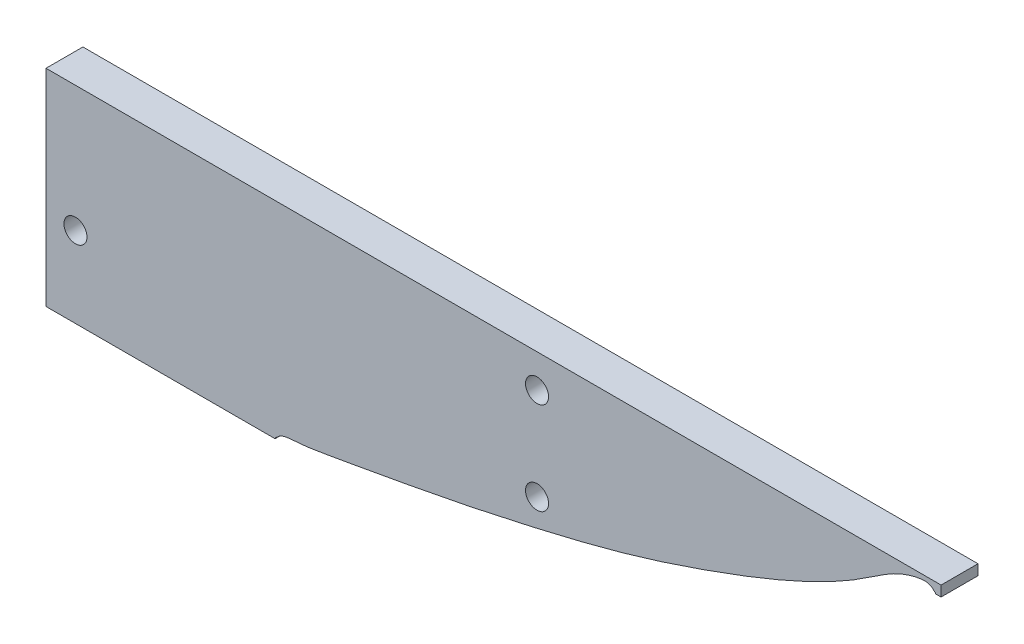
ISO-10303-21;
HEADER;
FILE_DESCRIPTION(('STEP AP214'),'2;1');
FILE_NAME('part.step','',(''),(''),'','','');
FILE_SCHEMA(('AUTOMOTIVE_DESIGN { 1 0 10303 214 1 1 1 1 }'));
ENDSEC;
DATA;
#1=APPLICATION_CONTEXT('core data for automotive mechanical design processes');
#2=APPLICATION_PROTOCOL_DEFINITION('international standard','automotive_design',2000,#1);
#3=PRODUCT_CONTEXT('',#1,'mechanical');
#4=PRODUCT('Part','Part','',(#3));
#5=PRODUCT_RELATED_PRODUCT_CATEGORY('part','',(#4));
#6=PRODUCT_DEFINITION_FORMATION('','',#4);
#7=PRODUCT_DEFINITION_CONTEXT('part definition',#1,'design');
#8=PRODUCT_DEFINITION('design','',#6,#7);
#9=PRODUCT_DEFINITION_SHAPE('','',#8);
#10=(LENGTH_UNIT() NAMED_UNIT(*) SI_UNIT(.MILLI.,.METRE.));
#11=(NAMED_UNIT(*) PLANE_ANGLE_UNIT() SI_UNIT($,.RADIAN.));
#12=(NAMED_UNIT(*) SI_UNIT($,.STERADIAN.) SOLID_ANGLE_UNIT());
#13=UNCERTAINTY_MEASURE_WITH_UNIT(LENGTH_MEASURE(1.E-05),#10,'distance_accuracy_value','');
#14=(GEOMETRIC_REPRESENTATION_CONTEXT(3) GLOBAL_UNCERTAINTY_ASSIGNED_CONTEXT((#13)) GLOBAL_UNIT_ASSIGNED_CONTEXT((#10,
#11,#12)) REPRESENTATION_CONTEXT('',''));
#15=CARTESIAN_POINT('',(0.,0.,0.));
#16=DIRECTION('',(0.,0.,1.));
#17=DIRECTION('',(1.,0.,0.));
#18=AXIS2_PLACEMENT_3D('',#15,#16,#17);
#19=CARTESIAN_POINT('',(17.1243728564483,-26.6404791174765,292.));
#20=DIRECTION('',(0.,0.,-1.));
#21=DIRECTION('',(-1.,0.,0.));
#22=AXIS2_PLACEMENT_3D('',#19,#20,#21);
#23=PLANE('',#22);
#24=CARTESIAN_POINT('',(0.0705666698621599,-25.,292.));
#25=DIRECTION('',(0.,0.,-1.));
#26=DIRECTION('',(-1.,0.,0.));
#27=AXIS2_PLACEMENT_3D('',#24,#25,#26);
#28=CIRCLE('',#27,2.5);
#29=CARTESIAN_POINT('',(-2.42943333013784,-25.,292.));
#30=VERTEX_POINT('',#29);
#31=EDGE_CURVE('E238',#30,#30,#28,.F.);
#32=ORIENTED_EDGE('',*,*,#31,.F.);
#33=EDGE_LOOP('',(#32));
#34=FACE_BOUND('',#33,.T.);
#35=CARTESIAN_POINT('',(86.5193378007218,1.10669936756458E-13,292.));
#36=CARTESIAN_POINT('',(86.4862790081582,0.0962597621961791,292.));
#37=CARTESIAN_POINT('',(86.4244500572542,0.17790147447394,292.));
#38=CARTESIAN_POINT('',(86.2815064068732,0.320825144004081,292.));
#39=CARTESIAN_POINT('',(86.2036291125369,0.384639030602337,292.));
#40=CARTESIAN_POINT('',(85.9706761006142,0.576891243185454,292.));
#41=CARTESIAN_POINT('',(85.8191488829801,0.709724725340839,292.));
#42=CARTESIAN_POINT('',(85.4904421493879,0.944124081837574,292.));
#43=CARTESIAN_POINT('',(85.3174465483556,1.04401765588407,292.));
#44=CARTESIAN_POINT('',(85.0338386836463,1.14556872036401,292.));
#45=CARTESIAN_POINT('',(84.9354194814334,1.17253531765186,292.));
#46=CARTESIAN_POINT('',(84.7388247548694,1.21363550304273,292.));
#47=CARTESIAN_POINT('',(84.6399014764517,1.22812207648879,292.));
#48=CARTESIAN_POINT('',(84.3417818792642,1.25850605059878,292.));
#49=CARTESIAN_POINT('',(84.1408367507932,1.26185781245953,292.));
#50=CARTESIAN_POINT('',(83.7389517485785,1.24965078016579,292.));
#51=CARTESIAN_POINT('',(83.5397015606246,1.23494652381473,292.));
#52=CARTESIAN_POINT('',(82.946125708914,1.1696168691251,292.));
#53=CARTESIAN_POINT('',(82.556150370626,1.09688207626837,292.));
#54=CARTESIAN_POINT('',(81.7815553124875,0.924193956727364,292.));
#55=CARTESIAN_POINT('',(81.397027838196,0.823771816050497,292.));
#56=CARTESIAN_POINT('',(80.6329455397681,0.597655337276839,292.));
#57=CARTESIAN_POINT('',(80.2534898519047,0.472294850637928,292.));
#58=CARTESIAN_POINT('',(79.1347487645557,0.066933477544559,292.));
#59=CARTESIAN_POINT('',(78.4109544343883,-0.244846641075704,292.));
#60=CARTESIAN_POINT('',(76.3037119302745,-1.30111184940393,292.));
#61=CARTESIAN_POINT('',(74.9812570061025,-2.1605882674563,292.));
#62=CARTESIAN_POINT('',(73.012868106171,-3.47863589350135,292.));
#63=CARTESIAN_POINT('',(72.3588964050103,-3.9220012521155,292.));
#64=CARTESIAN_POINT('',(71.0425433242173,-4.79342359867501,292.));
#65=CARTESIAN_POINT('',(70.3811463121936,-5.22330818465203,292.));
#66=CARTESIAN_POINT('',(68.3784340553434,-6.47945271713025,292.));
#67=CARTESIAN_POINT('',(67.0176553215151,-7.27049865431496,292.));
#68=CARTESIAN_POINT('',(64.2619432116094,-8.79079678295668,292.));
#69=CARTESIAN_POINT('',(62.8674151702466,-9.52078231982844,292.));
#70=CARTESIAN_POINT('',(60.0534337740831,-10.9356576648702,292.));
#71=CARTESIAN_POINT('',(58.6336688460083,-11.6199837640272,292.));
#72=CARTESIAN_POINT('',(55.7679281003753,-12.9412143255333,292.));
#73=CARTESIAN_POINT('',(54.3231814246012,-13.5784753310121,292.));
#74=CARTESIAN_POINT('',(49.9680149707943,-15.4346118173229,292.));
#75=CARTESIAN_POINT('',(47.0340497498493,-16.6012496027793,292.));
#76=CARTESIAN_POINT('',(41.133735633408,-18.8461693230346,292.));
#77=CARTESIAN_POINT('',(38.1657066142375,-19.9228932410447,292.));
#78=CARTESIAN_POINT('',(32.2044266865049,-21.997975534191,292.));
#79=CARTESIAN_POINT('',(29.2115132247264,-22.9979595653188,292.));
#80=CARTESIAN_POINT('',(23.1935285388077,-24.8995243197195,292.));
#81=CARTESIAN_POINT('',(20.1660422955707,-25.7975274973214,292.));
#82=CARTESIAN_POINT('',(14.0827034173254,-27.4834307376316,292.));
#83=CARTESIAN_POINT('',(11.0271965300401,-28.2725442778635,292.));
#84=CARTESIAN_POINT('',(4.89825720628841,-29.7810274909518,292.));
#85=CARTESIAN_POINT('',(1.82534026890185,-30.503499894055,292.));
#86=CARTESIAN_POINT('',(-7.40568625798334,-32.6136527882107,292.));
#87=CARTESIAN_POINT('',(-13.57923213932,-33.9331380147401,292.));
#88=CARTESIAN_POINT('',(-25.9695976396539,-36.361777090714,292.));
#89=CARTESIAN_POINT('',(-32.1831992386261,-37.480343491471,292.));
#90=CARTESIAN_POINT('',(-39.9513426039029,-38.8699583174506,292.));
#91=CARTESIAN_POINT('',(-41.5050766144523,-39.1473189251016,292.));
#92=CARTESIAN_POINT('',(-43.8369285317034,-39.5562123222397,292.));
#93=CARTESIAN_POINT('',(-44.6144305618867,-39.6912653287315,292.));
#94=CARTESIAN_POINT('',(-46.1697819880898,-39.959388388233,292.));
#95=CARTESIAN_POINT('',(-46.9472877219596,-40.0945807997366,292.));
#96=CARTESIAN_POINT('',(-48.5044895115571,-40.3507144330722,292.));
#97=CARTESIAN_POINT('',(-49.284581002103,-40.4691003882964,292.));
#98=CARTESIAN_POINT('',(-50.4602675555291,-40.6106385803979,292.));
#99=CARTESIAN_POINT('',(-50.8530521982789,-40.6520588401831,292.));
#100=CARTESIAN_POINT('',(-51.640361554793,-40.7223610754396,292.));
#101=CARTESIAN_POINT('',(-52.0352072229786,-40.7491440532411,292.));
#102=CARTESIAN_POINT('',(-52.8256272491158,-40.7975900849019,292.));
#103=CARTESIAN_POINT('',(-53.2207871806431,-40.8221649839273,292.));
#104=CARTESIAN_POINT('',(-54.0061453344125,-40.9061767703766,292.));
#105=CARTESIAN_POINT('',(-54.3969255741483,-40.9615242833646,292.));
#106=CARTESIAN_POINT('',(-54.9728332778868,-41.1166530805474,292.));
#107=CARTESIAN_POINT('',(-55.163008775375,-41.1809658447826,292.));
#108=CARTESIAN_POINT('',(-55.4436371129991,-41.3100008108665,292.));
#109=CARTESIAN_POINT('',(-55.5366574086851,-41.3588513616438,292.));
#110=CARTESIAN_POINT('',(-55.7134236431964,-41.465826689177,292.));
#111=CARTESIAN_POINT('',(-55.7982525340641,-41.5240164686866,292.));
#112=CARTESIAN_POINT('',(-56.0458001043853,-41.7077659939899,292.));
#113=CARTESIAN_POINT('',(-56.1993824071351,-41.8454128428669,292.));
#114=CARTESIAN_POINT('',(-56.4274655303399,-42.0549131429448,292.));
#115=CARTESIAN_POINT('',(-56.502689404142,-42.1260217191931,292.));
#116=CARTESIAN_POINT('',(-56.6371506499801,-42.2827013968764,292.));
#117=CARTESIAN_POINT('',(-56.6947280604683,-42.3718357842638,292.));
#118=CARTESIAN_POINT('',(-56.720801855106,-42.4717506298789,292.));
#119=B_SPLINE_CURVE_WITH_KNOTS('',3,(#35,#36,#37,#38,#39,#40,#41,#42,#43,#44,#45,#46,#47,#48,
#49,#50,#51,#52,#53,#54,#55,#56,#57,#58,#59,#60,#61,#62,#63,#64,#65,#66,#67,#68,#69,#70,#71,#72,
#73,#74,#75,#76,#77,#78,#79,#80,#81,#82,#83,#84,#85,#86,#87,#88,#89,#90,#91,#92,#93,#94,#95,#96,
#97,#98,#99,#100,#101,#102,#103,#104,#105,#106,#107,#108,#109,#110,#111,#112,#113,#114,#115,
#116,#117,#118),.UNSPECIFIED.,.F.,.F.,(4,2,2,2,2,2,2,2,2,2,2,2,2,2,2,2,2,2,2,2,2,2,2,2,2,2,2,2,
2,2,2,2,2,2,2,2,2,2,2,2,2,4),(0.,0.00195312500000022,0.00390625000000056,0.00781250000000078,
0.0117187500000011,0.0136718750000012,0.0156250000000014,0.0195312500000014,0.0234375000000014,
0.0312500000000016,0.0390625000000016,0.0468750000000017,0.0625000000000018,0.0937500000000018,
0.109375000000002,0.125000000000002,0.156250000000002,0.187500000000002,0.218750000000002,
0.250000000000002,0.312500000000002,0.375000000000001,0.437500000000001,0.500000000000001,
0.562500000000001,0.625000000000001,0.750000000000001,0.875,0.90625,0.921875,0.9375,0.953125,
0.9609375,0.96875,0.9765625,0.984375,0.98828125,0.990234375,0.9921875,0.99609375,0.998046875,
1.),.UNSPECIFIED.);
#120=CARTESIAN_POINT('',(-56.720801855106,-42.4717506298789,292.));
#121=VERTEX_POINT('',#120);
#122=CARTESIAN_POINT('',(86.5193378007219,0.,292.));
#123=VERTEX_POINT('',#122);
#124=EDGE_CURVE('E196',#121,#123,#119,.F.);
#125=ORIENTED_EDGE('',*,*,#124,.T.);
#126=DIRECTION('',(1.,0.,0.));
#127=VECTOR('',#126,1.);
#128=CARTESIAN_POINT('',(86.5193378007219,0.,292.));
#129=LINE('',#128,#127);
#130=CARTESIAN_POINT('',(87.6687095894295,0.,292.));
#131=VERTEX_POINT('',#130);
#132=EDGE_CURVE('E90',#123,#131,#129,.T.);
#133=ORIENTED_EDGE('',*,*,#132,.T.);
#134=DIRECTION('',(0.,1.,0.));
#135=VECTOR('',#134,1.);
#136=CARTESIAN_POINT('',(87.6687095894295,2.25600000000004,292.));
#137=LINE('',#136,#135);
#138=CARTESIAN_POINT('',(87.6687095894295,2.25600000000004,292.));
#139=VERTEX_POINT('',#138);
#140=EDGE_CURVE('E103',#131,#139,#137,.T.);
#141=ORIENTED_EDGE('',*,*,#140,.T.);
#142=DIRECTION('',(-1.,0.,0.));
#143=VECTOR('',#142,1.);
#144=CARTESIAN_POINT('',(87.6687095894295,2.25600000000004,292.));
#145=LINE('',#144,#143);
#146=CARTESIAN_POINT('',(-106.384333984056,2.25600000000002,292.));
#147=VERTEX_POINT('',#146);
#148=EDGE_CURVE('E97',#139,#147,#145,.T.);
#149=ORIENTED_EDGE('',*,*,#148,.T.);
#150=DIRECTION('',(0.,-1.,0.));
#151=VECTOR('',#150,1.);
#152=CARTESIAN_POINT('',(-106.384333984056,-42.4789395707057,292.));
#153=LINE('',#152,#151);
#154=CARTESIAN_POINT('',(-106.384333984056,-42.4789395707057,292.));
#155=VERTEX_POINT('',#154);
#156=EDGE_CURVE('E101',#147,#155,#153,.T.);
#157=ORIENTED_EDGE('',*,*,#156,.T.);
#158=CARTESIAN_POINT('',(-56.720801855106,-42.4717506298789,292.));
#159=CARTESIAN_POINT('',(-73.2753123176523,-42.4754820755239,292.));
#160=CARTESIAN_POINT('',(-89.829823139409,-42.477811434834,292.));
#161=CARTESIAN_POINT('',(-106.384333984056,-42.4789395707057,292.));
#162=B_SPLINE_CURVE_WITH_KNOTS('',3,(#158,#159,#160,#161),.UNSPECIFIED.,.F.,.F.,(4,4),(0.,1.),.UNSPECIFIED.);
#163=EDGE_CURVE('E51',#155,#121,#162,.F.);
#164=ORIENTED_EDGE('',*,*,#163,.T.);
#165=EDGE_LOOP('',(#125,#133,#141,#149,#157,#164));
#166=FACE_BOUND('',#165,.T.);
#167=CARTESIAN_POINT('',(0.0705666698621599,-4.96037406111782,292.));
#168=DIRECTION('',(0.,0.,-1.));
#169=DIRECTION('',(-1.,0.,0.));
#170=AXIS2_PLACEMENT_3D('',#167,#168,#169);
#171=CIRCLE('',#170,2.5);
#172=CARTESIAN_POINT('',(-2.42943333013784,-4.96037406111782,292.));
#173=VERTEX_POINT('',#172);
#174=EDGE_CURVE('E237',#173,#173,#171,.F.);
#175=ORIENTED_EDGE('',*,*,#174,.F.);
#176=EDGE_LOOP('',(#175));
#177=FACE_BOUND('',#176,.T.);
#178=CARTESIAN_POINT('',(-100.,-25.,292.));
#179=DIRECTION('',(0.,0.,-1.));
#180=DIRECTION('',(-1.,0.,0.));
#181=AXIS2_PLACEMENT_3D('',#178,#179,#180);
#182=CIRCLE('',#181,2.5);
#183=CARTESIAN_POINT('',(-102.5,-25.,292.));
#184=VERTEX_POINT('',#183);
#185=EDGE_CURVE('E241',#184,#184,#182,.F.);
#186=ORIENTED_EDGE('',*,*,#185,.F.);
#187=EDGE_LOOP('',(#186));
#188=FACE_BOUND('',#187,.T.);
#189=ADVANCED_FACE('F30',(#34,#166,#177,#188),#23,.F.);
#190=CARTESIAN_POINT('',(17.1243728564483,-26.6404791174765,284.));
#191=DIRECTION('',(0.,0.,-1.));
#192=DIRECTION('',(-1.,0.,0.));
#193=AXIS2_PLACEMENT_3D('',#190,#191,#192);
#194=PLANE('',#193);
#195=CARTESIAN_POINT('',(0.0705666698621599,-25.,284.));
#196=DIRECTION('',(0.,0.,-1.));
#197=DIRECTION('',(-1.,0.,0.));
#198=AXIS2_PLACEMENT_3D('',#195,#196,#197);
#199=CIRCLE('',#198,2.5);
#200=CARTESIAN_POINT('',(-2.42943333013784,-25.,284.));
#201=VERTEX_POINT('',#200);
#202=EDGE_CURVE('E239',#201,#201,#199,.F.);
#203=ORIENTED_EDGE('',*,*,#202,.T.);
#204=EDGE_LOOP('',(#203));
#205=FACE_BOUND('',#204,.T.);
#206=CARTESIAN_POINT('',(-56.720801855106,-42.4717506298789,284.));
#207=CARTESIAN_POINT('',(-56.6947280604683,-42.3718357842638,284.));
#208=CARTESIAN_POINT('',(-56.6371506499801,-42.2827013968764,284.));
#209=CARTESIAN_POINT('',(-56.502689404142,-42.1260217191931,284.));
#210=CARTESIAN_POINT('',(-56.4274655303399,-42.0549131429448,284.));
#211=CARTESIAN_POINT('',(-56.1993824071351,-41.8454128428669,284.));
#212=CARTESIAN_POINT('',(-56.0458001043853,-41.7077659939899,284.));
#213=CARTESIAN_POINT('',(-55.7982525340641,-41.5240164686866,284.));
#214=CARTESIAN_POINT('',(-55.7134236431964,-41.465826689177,284.));
#215=CARTESIAN_POINT('',(-55.5366574086851,-41.3588513616438,284.));
#216=CARTESIAN_POINT('',(-55.4436371129991,-41.3100008108665,284.));
#217=CARTESIAN_POINT('',(-55.163008775375,-41.1809658447826,284.));
#218=CARTESIAN_POINT('',(-54.9728332778868,-41.1166530805474,284.));
#219=CARTESIAN_POINT('',(-54.3969255741483,-40.9615242833646,284.));
#220=CARTESIAN_POINT('',(-54.0061453344125,-40.9061767703766,284.));
#221=CARTESIAN_POINT('',(-53.2207871806431,-40.8221649839273,284.));
#222=CARTESIAN_POINT('',(-52.8256272491158,-40.7975900849019,284.));
#223=CARTESIAN_POINT('',(-52.0352072229786,-40.7491440532411,284.));
#224=CARTESIAN_POINT('',(-51.640361554793,-40.7223610754396,284.));
#225=CARTESIAN_POINT('',(-50.8530521982789,-40.6520588401831,284.));
#226=CARTESIAN_POINT('',(-50.4602675555291,-40.6106385803979,284.));
#227=CARTESIAN_POINT('',(-49.284581002103,-40.4691003882964,284.));
#228=CARTESIAN_POINT('',(-48.5044895115571,-40.3507144330722,284.));
#229=CARTESIAN_POINT('',(-46.9472877219596,-40.0945807997366,284.));
#230=CARTESIAN_POINT('',(-46.1697819880898,-39.959388388233,284.));
#231=CARTESIAN_POINT('',(-44.6144305618867,-39.6912653287315,284.));
#232=CARTESIAN_POINT('',(-43.8369285317034,-39.5562123222397,284.));
#233=CARTESIAN_POINT('',(-41.5050766144523,-39.1473189251016,284.));
#234=CARTESIAN_POINT('',(-39.9513426039029,-38.8699583174506,284.));
#235=CARTESIAN_POINT('',(-32.1831992386261,-37.480343491471,284.));
#236=CARTESIAN_POINT('',(-25.9695976396539,-36.361777090714,284.));
#237=CARTESIAN_POINT('',(-13.57923213932,-33.9331380147401,284.));
#238=CARTESIAN_POINT('',(-7.40568625798334,-32.6136527882107,284.));
#239=CARTESIAN_POINT('',(1.82534026890185,-30.503499894055,284.));
#240=CARTESIAN_POINT('',(4.89825720628841,-29.7810274909518,284.));
#241=CARTESIAN_POINT('',(11.0271965300401,-28.2725442778635,284.));
#242=CARTESIAN_POINT('',(14.0827034173254,-27.4834307376316,284.));
#243=CARTESIAN_POINT('',(20.1660422955707,-25.7975274973214,284.));
#244=CARTESIAN_POINT('',(23.1935285388077,-24.8995243197195,284.));
#245=CARTESIAN_POINT('',(29.2115132247264,-22.9979595653188,284.));
#246=CARTESIAN_POINT('',(32.2044266865049,-21.997975534191,284.));
#247=CARTESIAN_POINT('',(38.1657066142375,-19.9228932410447,284.));
#248=CARTESIAN_POINT('',(41.133735633408,-18.8461693230346,284.));
#249=CARTESIAN_POINT('',(47.0340497498493,-16.6012496027793,284.));
#250=CARTESIAN_POINT('',(49.9680149707943,-15.4346118173229,284.));
#251=CARTESIAN_POINT('',(54.3231814246012,-13.5784753310121,284.));
#252=CARTESIAN_POINT('',(55.7679281003753,-12.9412143255333,284.));
#253=CARTESIAN_POINT('',(58.6336688460083,-11.6199837640272,284.));
#254=CARTESIAN_POINT('',(60.0534337740831,-10.9356576648702,284.));
#255=CARTESIAN_POINT('',(62.8674151702466,-9.52078231982844,284.));
#256=CARTESIAN_POINT('',(64.2619432116094,-8.79079678295668,284.));
#257=CARTESIAN_POINT('',(67.0176553215151,-7.27049865431496,284.));
#258=CARTESIAN_POINT('',(68.3784340553434,-6.47945271713025,284.));
#259=CARTESIAN_POINT('',(70.3811463121936,-5.22330818465203,284.));
#260=CARTESIAN_POINT('',(71.0425433242173,-4.79342359867501,284.));
#261=CARTESIAN_POINT('',(72.3588964050103,-3.9220012521155,284.));
#262=CARTESIAN_POINT('',(73.012868106171,-3.47863589350135,284.));
#263=CARTESIAN_POINT('',(74.9812570061025,-2.1605882674563,284.));
#264=CARTESIAN_POINT('',(76.3037119302745,-1.30111184940393,284.));
#265=CARTESIAN_POINT('',(78.4109544343883,-0.244846641075704,284.));
#266=CARTESIAN_POINT('',(79.1347487645557,0.066933477544559,284.));
#267=CARTESIAN_POINT('',(80.2534898519047,0.472294850637928,284.));
#268=CARTESIAN_POINT('',(80.6329455397681,0.597655337276839,284.));
#269=CARTESIAN_POINT('',(81.397027838196,0.823771816050497,284.));
#270=CARTESIAN_POINT('',(81.7815553124875,0.924193956727364,284.));
#271=CARTESIAN_POINT('',(82.556150370626,1.09688207626837,284.));
#272=CARTESIAN_POINT('',(82.946125708914,1.1696168691251,284.));
#273=CARTESIAN_POINT('',(83.5397015606246,1.23494652381473,284.));
#274=CARTESIAN_POINT('',(83.7389517485785,1.24965078016579,284.));
#275=CARTESIAN_POINT('',(84.1408367507932,1.26185781245953,284.));
#276=CARTESIAN_POINT('',(84.3417818792642,1.25850605059878,284.));
#277=CARTESIAN_POINT('',(84.6399014764517,1.22812207648879,284.));
#278=CARTESIAN_POINT('',(84.7388247548694,1.21363550304273,284.));
#279=CARTESIAN_POINT('',(84.9354194814334,1.17253531765186,284.));
#280=CARTESIAN_POINT('',(85.0338386836463,1.14556872036401,284.));
#281=CARTESIAN_POINT('',(85.3174465483556,1.04401765588407,284.));
#282=CARTESIAN_POINT('',(85.4904421493879,0.944124081837574,284.));
#283=CARTESIAN_POINT('',(85.8191488829801,0.709724725340839,284.));
#284=CARTESIAN_POINT('',(85.9706761006142,0.576891243185454,284.));
#285=CARTESIAN_POINT('',(86.2036291125369,0.384639030602337,284.));
#286=CARTESIAN_POINT('',(86.2815064068732,0.320825144004081,284.));
#287=CARTESIAN_POINT('',(86.4244500572542,0.17790147447394,284.));
#288=CARTESIAN_POINT('',(86.4862790081582,0.0962597621961791,284.));
#289=CARTESIAN_POINT('',(86.5193378007218,1.10669936756458E-13,284.));
#290=B_SPLINE_CURVE_WITH_KNOTS('',3,(#206,#207,#208,#209,#210,#211,#212,#213,#214,#215,#216,
#217,#218,#219,#220,#221,#222,#223,#224,#225,#226,#227,#228,#229,#230,#231,#232,#233,#234,#235,
#236,#237,#238,#239,#240,#241,#242,#243,#244,#245,#246,#247,#248,#249,#250,#251,#252,#253,#254,
#255,#256,#257,#258,#259,#260,#261,#262,#263,#264,#265,#266,#267,#268,#269,#270,#271,#272,#273,
#274,#275,#276,#277,#278,#279,#280,#281,#282,#283,#284,#285,#286,#287,#288,#289),.UNSPECIFIED.,
.F.,.F.,(4,2,2,2,2,2,2,2,2,2,2,2,2,2,2,2,2,2,2,2,2,2,2,2,2,2,2,2,2,2,2,2,2,2,2,2,2,2,2,2,2,4),
(0.,0.001953125,0.00390625000000011,0.00781250000000011,0.009765625,0.01171875,
0.0156249999999999,0.0234374999999998,0.0312499999999997,0.0390624999999997,0.0468749999999996,
0.0624999999999996,0.0781249999999996,0.0937499999999996,0.125,0.249999999999999,
0.374999999999999,0.437499999999999,0.499999999999999,0.562499999999999,0.624999999999999,
0.687499999999998,0.749999999999998,0.781249999999998,0.812499999999998,0.843749999999998,
0.874999999999998,0.890624999999998,0.906249999999998,0.937499999999998,0.953124999999998,
0.960937499999998,0.968749999999998,0.976562499999999,0.980468749999999,0.984374999999999,
0.986328124999999,0.988281249999999,0.992187499999999,0.996093749999999,0.998046875,1.),.UNSPECIFIED.);
#291=CARTESIAN_POINT('',(-56.720801855106,-42.4717506298789,284.));
#292=VERTEX_POINT('',#291);
#293=CARTESIAN_POINT('',(86.5193378007219,0.,284.));
#294=VERTEX_POINT('',#293);
#295=EDGE_CURVE('E213',#292,#294,#290,.T.);
#296=ORIENTED_EDGE('',*,*,#295,.F.);
#297=CARTESIAN_POINT('',(-106.384333984056,-42.4789395707057,284.));
#298=CARTESIAN_POINT('',(-89.829823139409,-42.477811434834,284.));
#299=CARTESIAN_POINT('',(-73.2753123176523,-42.4754820755239,284.));
#300=CARTESIAN_POINT('',(-56.720801855106,-42.4717506298789,284.));
#301=B_SPLINE_CURVE_WITH_KNOTS('',3,(#297,#298,#299,#300),.UNSPECIFIED.,.F.,.F.,(4,4),(0.,1.),.UNSPECIFIED.);
#302=CARTESIAN_POINT('',(-106.384333984056,-42.4789395707057,284.));
#303=VERTEX_POINT('',#302);
#304=EDGE_CURVE('E81',#303,#292,#301,.T.);
#305=ORIENTED_EDGE('',*,*,#304,.F.);
#306=DIRECTION('',(0.,-1.,0.));
#307=VECTOR('',#306,1.);
#308=CARTESIAN_POINT('',(-106.384333984056,-42.4789395707057,284.));
#309=LINE('',#308,#307);
#310=CARTESIAN_POINT('',(-106.384333984056,2.25600000000002,284.));
#311=VERTEX_POINT('',#310);
#312=EDGE_CURVE('E75',#311,#303,#309,.T.);
#313=ORIENTED_EDGE('',*,*,#312,.F.);
#314=DIRECTION('',(-1.,0.,0.));
#315=VECTOR('',#314,1.);
#316=CARTESIAN_POINT('',(87.6687095894295,2.25600000000004,284.));
#317=LINE('',#316,#315);
#318=CARTESIAN_POINT('',(87.6687095894295,2.25600000000004,284.));
#319=VERTEX_POINT('',#318);
#320=EDGE_CURVE('E111',#319,#311,#317,.T.);
#321=ORIENTED_EDGE('',*,*,#320,.F.);
#322=DIRECTION('',(0.,1.,0.));
#323=VECTOR('',#322,1.);
#324=CARTESIAN_POINT('',(87.6687095894295,2.25600000000004,284.));
#325=LINE('',#324,#323);
#326=CARTESIAN_POINT('',(87.6687095894295,0.,284.));
#327=VERTEX_POINT('',#326);
#328=EDGE_CURVE('E158',#327,#319,#325,.T.);
#329=ORIENTED_EDGE('',*,*,#328,.F.);
#330=DIRECTION('',(1.,0.,0.));
#331=VECTOR('',#330,1.);
#332=CARTESIAN_POINT('',(86.5193378007219,0.,284.));
#333=LINE('',#332,#331);
#334=EDGE_CURVE('E163',#294,#327,#333,.T.);
#335=ORIENTED_EDGE('',*,*,#334,.F.);
#336=EDGE_LOOP('',(#296,#305,#313,#321,#329,#335));
#337=FACE_BOUND('',#336,.T.);
#338=CARTESIAN_POINT('',(0.0705666698621599,-4.96037406111782,284.));
#339=DIRECTION('',(0.,0.,-1.));
#340=DIRECTION('',(-1.,0.,0.));
#341=AXIS2_PLACEMENT_3D('',#338,#339,#340);
#342=CIRCLE('',#341,2.5);
#343=CARTESIAN_POINT('',(-2.42943333013784,-4.96037406111782,284.));
#344=VERTEX_POINT('',#343);
#345=EDGE_CURVE('E235',#344,#344,#342,.F.);
#346=ORIENTED_EDGE('',*,*,#345,.T.);
#347=EDGE_LOOP('',(#346));
#348=FACE_BOUND('',#347,.T.);
#349=CARTESIAN_POINT('',(-100.,-25.,284.));
#350=DIRECTION('',(0.,0.,-1.));
#351=DIRECTION('',(-1.,0.,0.));
#352=AXIS2_PLACEMENT_3D('',#349,#350,#351);
#353=CIRCLE('',#352,2.5);
#354=CARTESIAN_POINT('',(-102.5,-25.,284.));
#355=VERTEX_POINT('',#354);
#356=EDGE_CURVE('E36',#355,#355,#353,.F.);
#357=ORIENTED_EDGE('',*,*,#356,.T.);
#358=EDGE_LOOP('',(#357));
#359=FACE_BOUND('',#358,.T.);
#360=ADVANCED_FACE('F148',(#205,#337,#348,#359),#194,.T.);
#361=CARTESIAN_POINT('',(-56.720801855106,-42.4717506298789,292.));
#362=CARTESIAN_POINT('',(-56.6947280604683,-42.3718357842638,292.));
#363=CARTESIAN_POINT('',(-56.6371506499801,-42.2827013968764,292.));
#364=CARTESIAN_POINT('',(-56.502689404142,-42.1260217191931,292.));
#365=CARTESIAN_POINT('',(-56.4274655303399,-42.0549131429448,292.));
#366=CARTESIAN_POINT('',(-56.1993824071351,-41.8454128428669,292.));
#367=CARTESIAN_POINT('',(-56.0458001043853,-41.7077659939899,292.));
#368=CARTESIAN_POINT('',(-55.7982525340641,-41.5240164686866,292.));
#369=CARTESIAN_POINT('',(-55.7134236431964,-41.465826689177,292.));
#370=CARTESIAN_POINT('',(-55.5366574086851,-41.3588513616438,292.));
#371=CARTESIAN_POINT('',(-55.4436371129991,-41.3100008108665,292.));
#372=CARTESIAN_POINT('',(-55.163008775375,-41.1809658447826,292.));
#373=CARTESIAN_POINT('',(-54.9728332778868,-41.1166530805474,292.));
#374=CARTESIAN_POINT('',(-54.3969255741483,-40.9615242833646,292.));
#375=CARTESIAN_POINT('',(-54.0061453344125,-40.9061767703766,292.));
#376=CARTESIAN_POINT('',(-53.2207871806431,-40.8221649839273,292.));
#377=CARTESIAN_POINT('',(-52.8256272491158,-40.7975900849019,292.));
#378=CARTESIAN_POINT('',(-52.0352072229786,-40.7491440532411,292.));
#379=CARTESIAN_POINT('',(-51.640361554793,-40.7223610754396,292.));
#380=CARTESIAN_POINT('',(-50.8530521982789,-40.6520588401831,292.));
#381=CARTESIAN_POINT('',(-50.4602675555291,-40.6106385803979,292.));
#382=CARTESIAN_POINT('',(-49.284581002103,-40.4691003882964,292.));
#383=CARTESIAN_POINT('',(-48.5044895115571,-40.3507144330722,292.));
#384=CARTESIAN_POINT('',(-46.9472877219596,-40.0945807997366,292.));
#385=CARTESIAN_POINT('',(-46.1697819880898,-39.959388388233,292.));
#386=CARTESIAN_POINT('',(-44.6144305618867,-39.6912653287315,292.));
#387=CARTESIAN_POINT('',(-43.8369285317034,-39.5562123222397,292.));
#388=CARTESIAN_POINT('',(-41.5050766144523,-39.1473189251016,292.));
#389=CARTESIAN_POINT('',(-39.9513426039029,-38.8699583174506,292.));
#390=CARTESIAN_POINT('',(-32.1831992386261,-37.480343491471,292.));
#391=CARTESIAN_POINT('',(-25.9695976396539,-36.361777090714,292.));
#392=CARTESIAN_POINT('',(-13.57923213932,-33.9331380147401,292.));
#393=CARTESIAN_POINT('',(-7.40568625798334,-32.6136527882107,292.));
#394=CARTESIAN_POINT('',(1.82534026890185,-30.503499894055,292.));
#395=CARTESIAN_POINT('',(4.89825720628841,-29.7810274909518,292.));
#396=CARTESIAN_POINT('',(11.0271965300401,-28.2725442778635,292.));
#397=CARTESIAN_POINT('',(14.0827034173254,-27.4834307376316,292.));
#398=CARTESIAN_POINT('',(20.1660422955707,-25.7975274973214,292.));
#399=CARTESIAN_POINT('',(23.1935285388077,-24.8995243197195,292.));
#400=CARTESIAN_POINT('',(29.2115132247264,-22.9979595653188,292.));
#401=CARTESIAN_POINT('',(32.2044266865049,-21.997975534191,292.));
#402=CARTESIAN_POINT('',(38.1657066142375,-19.9228932410447,292.));
#403=CARTESIAN_POINT('',(41.133735633408,-18.8461693230346,292.));
#404=CARTESIAN_POINT('',(47.0340497498493,-16.6012496027793,292.));
#405=CARTESIAN_POINT('',(49.9680149707943,-15.4346118173229,292.));
#406=CARTESIAN_POINT('',(54.3231814246012,-13.5784753310121,292.));
#407=CARTESIAN_POINT('',(55.7679281003753,-12.9412143255333,292.));
#408=CARTESIAN_POINT('',(58.6336688460083,-11.6199837640272,292.));
#409=CARTESIAN_POINT('',(60.0534337740831,-10.9356576648702,292.));
#410=CARTESIAN_POINT('',(62.8674151702466,-9.52078231982844,292.));
#411=CARTESIAN_POINT('',(64.2619432116094,-8.79079678295668,292.));
#412=CARTESIAN_POINT('',(67.0176553215151,-7.27049865431496,292.));
#413=CARTESIAN_POINT('',(68.3784340553434,-6.47945271713025,292.));
#414=CARTESIAN_POINT('',(70.3811463121936,-5.22330818465203,292.));
#415=CARTESIAN_POINT('',(71.0425433242173,-4.79342359867501,292.));
#416=CARTESIAN_POINT('',(72.3588964050103,-3.9220012521155,292.));
#417=CARTESIAN_POINT('',(73.012868106171,-3.47863589350135,292.));
#418=CARTESIAN_POINT('',(74.9812570061025,-2.1605882674563,292.));
#419=CARTESIAN_POINT('',(76.3037119302745,-1.30111184940393,292.));
#420=CARTESIAN_POINT('',(78.4109544343883,-0.244846641075704,292.));
#421=CARTESIAN_POINT('',(79.1347487645557,0.066933477544559,292.));
#422=CARTESIAN_POINT('',(80.2534898519047,0.472294850637928,292.));
#423=CARTESIAN_POINT('',(80.6329455397681,0.597655337276839,292.));
#424=CARTESIAN_POINT('',(81.397027838196,0.823771816050497,292.));
#425=CARTESIAN_POINT('',(81.7815553124875,0.924193956727364,292.));
#426=CARTESIAN_POINT('',(82.556150370626,1.09688207626837,292.));
#427=CARTESIAN_POINT('',(82.946125708914,1.1696168691251,292.));
#428=CARTESIAN_POINT('',(83.5397015606246,1.23494652381473,292.));
#429=CARTESIAN_POINT('',(83.7389517485785,1.24965078016579,292.));
#430=CARTESIAN_POINT('',(84.1408367507932,1.26185781245953,292.));
#431=CARTESIAN_POINT('',(84.3417818792642,1.25850605059878,292.));
#432=CARTESIAN_POINT('',(84.6399014764517,1.22812207648879,292.));
#433=CARTESIAN_POINT('',(84.7388247548694,1.21363550304273,292.));
#434=CARTESIAN_POINT('',(84.9354194814334,1.17253531765186,292.));
#435=CARTESIAN_POINT('',(85.0338386836463,1.14556872036401,292.));
#436=CARTESIAN_POINT('',(85.3174465483556,1.04401765588407,292.));
#437=CARTESIAN_POINT('',(85.4904421493879,0.944124081837574,292.));
#438=CARTESIAN_POINT('',(85.8191488829801,0.709724725340839,292.));
#439=CARTESIAN_POINT('',(85.9706761006142,0.576891243185454,292.));
#440=CARTESIAN_POINT('',(86.2036291125369,0.384639030602337,292.));
#441=CARTESIAN_POINT('',(86.2815064068732,0.320825144004081,292.));
#442=CARTESIAN_POINT('',(86.4244500572542,0.17790147447394,292.));
#443=CARTESIAN_POINT('',(86.4862790081582,0.0962597621961791,292.));
#444=CARTESIAN_POINT('',(86.5193378007218,1.10669936756458E-13,292.));
#445=B_SPLINE_CURVE_WITH_KNOTS('',3,(#361,#362,#363,#364,#365,#366,#367,#368,#369,#370,#371,
#372,#373,#374,#375,#376,#377,#378,#379,#380,#381,#382,#383,#384,#385,#386,#387,#388,#389,#390,
#391,#392,#393,#394,#395,#396,#397,#398,#399,#400,#401,#402,#403,#404,#405,#406,#407,#408,#409,
#410,#411,#412,#413,#414,#415,#416,#417,#418,#419,#420,#421,#422,#423,#424,#425,#426,#427,#428,
#429,#430,#431,#432,#433,#434,#435,#436,#437,#438,#439,#440,#441,#442,#443,#444),.UNSPECIFIED.,
.F.,.F.,(4,2,2,2,2,2,2,2,2,2,2,2,2,2,2,2,2,2,2,2,2,2,2,2,2,2,2,2,2,2,2,2,2,2,2,2,2,2,2,2,2,4),
(0.,0.001953125,0.00390625000000011,0.00781250000000011,0.009765625,0.01171875,
0.0156249999999999,0.0234374999999998,0.0312499999999997,0.0390624999999997,0.0468749999999996,
0.0624999999999996,0.0781249999999996,0.0937499999999996,0.125,0.249999999999999,
0.374999999999999,0.437499999999999,0.499999999999999,0.562499999999999,0.624999999999999,
0.687499999999998,0.749999999999998,0.781249999999998,0.812499999999998,0.843749999999998,
0.874999999999998,0.890624999999998,0.906249999999998,0.937499999999998,0.953124999999998,
0.960937499999998,0.968749999999998,0.976562499999999,0.980468749999999,0.984374999999999,
0.986328124999999,0.988281249999999,0.992187499999999,0.996093749999999,0.998046875,1.),.UNSPECIFIED.);
#446=DIRECTION('',(0.,0.,-1.));
#447=VECTOR('',#446,1.);
#448=SURFACE_OF_LINEAR_EXTRUSION('',#445,#447);
#449=ORIENTED_EDGE('',*,*,#295,.T.);
#450=DIRECTION('',(0.,0.,-1.));
#451=VECTOR('',#450,1.);
#452=CARTESIAN_POINT('',(86.5193378007219,0.,292.));
#453=LINE('',#452,#451);
#454=EDGE_CURVE('E11',#123,#294,#453,.T.);
#455=ORIENTED_EDGE('',*,*,#454,.F.);
#456=ORIENTED_EDGE('',*,*,#124,.F.);
#457=DIRECTION('',(0.,0.,-1.));
#458=VECTOR('',#457,1.);
#459=CARTESIAN_POINT('',(-56.720801855106,-42.4717506298789,292.));
#460=LINE('',#459,#458);
#461=EDGE_CURVE('E117',#121,#292,#460,.T.);
#462=ORIENTED_EDGE('',*,*,#461,.T.);
#463=EDGE_LOOP('',(#449,#455,#456,#462));
#464=FACE_BOUND('',#463,.T.);
#465=ADVANCED_FACE('F32',(#464),#448,.F.);
#466=CARTESIAN_POINT('',(86.5193378007219,0.,292.));
#467=DIRECTION('',(0.,1.,0.));
#468=DIRECTION('',(-1.,0.,0.));
#469=AXIS2_PLACEMENT_3D('',#466,#467,#468);
#470=PLANE('',#469);
#471=ORIENTED_EDGE('',*,*,#334,.T.);
#472=DIRECTION('',(0.,0.,-1.));
#473=VECTOR('',#472,1.);
#474=CARTESIAN_POINT('',(87.6687095894295,0.,292.));
#475=LINE('',#474,#473);
#476=EDGE_CURVE('E42',#131,#327,#475,.T.);
#477=ORIENTED_EDGE('',*,*,#476,.F.);
#478=ORIENTED_EDGE('',*,*,#132,.F.);
#479=ORIENTED_EDGE('',*,*,#454,.T.);
#480=EDGE_LOOP('',(#471,#477,#478,#479));
#481=FACE_BOUND('',#480,.T.);
#482=ADVANCED_FACE('F322',(#481),#470,.F.);
#483=CARTESIAN_POINT('',(87.6687095894295,2.25600000000004,292.));
#484=DIRECTION('',(-1.,0.,0.));
#485=DIRECTION('',(0.,0.,1.));
#486=AXIS2_PLACEMENT_3D('',#483,#484,#485);
#487=PLANE('',#486);
#488=ORIENTED_EDGE('',*,*,#328,.T.);
#489=DIRECTION('',(0.,0.,-1.));
#490=VECTOR('',#489,1.);
#491=CARTESIAN_POINT('',(87.6687095894295,2.25600000000004,292.));
#492=LINE('',#491,#490);
#493=EDGE_CURVE('E112',#139,#319,#492,.T.);
#494=ORIENTED_EDGE('',*,*,#493,.F.);
#495=ORIENTED_EDGE('',*,*,#140,.F.);
#496=ORIENTED_EDGE('',*,*,#476,.T.);
#497=EDGE_LOOP('',(#488,#494,#495,#496));
#498=FACE_BOUND('',#497,.T.);
#499=ADVANCED_FACE('F314',(#498),#487,.F.);
#500=CARTESIAN_POINT('',(87.6687095894295,2.25600000000004,292.));
#501=DIRECTION('',(0.,-1.,0.));
#502=DIRECTION('',(1.,0.,0.));
#503=AXIS2_PLACEMENT_3D('',#500,#501,#502);
#504=PLANE('',#503);
#505=ORIENTED_EDGE('',*,*,#320,.T.);
#506=DIRECTION('',(0.,0.,-1.));
#507=VECTOR('',#506,1.);
#508=CARTESIAN_POINT('',(-106.384333984056,2.25600000000002,292.));
#509=LINE('',#508,#507);
#510=EDGE_CURVE('E108',#147,#311,#509,.T.);
#511=ORIENTED_EDGE('',*,*,#510,.F.);
#512=ORIENTED_EDGE('',*,*,#148,.F.);
#513=ORIENTED_EDGE('',*,*,#493,.T.);
#514=EDGE_LOOP('',(#505,#511,#512,#513));
#515=FACE_BOUND('',#514,.T.);
#516=ADVANCED_FACE('F109',(#515),#504,.F.);
#517=CARTESIAN_POINT('',(-106.384333984056,-42.4789395707057,292.));
#518=DIRECTION('',(1.,0.,0.));
#519=DIRECTION('',(0.,1.,0.));
#520=AXIS2_PLACEMENT_3D('',#517,#518,#519);
#521=PLANE('',#520);
#522=ORIENTED_EDGE('',*,*,#312,.T.);
#523=DIRECTION('',(0.,0.,-1.));
#524=VECTOR('',#523,1.);
#525=CARTESIAN_POINT('',(-106.384333984056,-42.4789395707057,292.));
#526=LINE('',#525,#524);
#527=EDGE_CURVE('E113',#155,#303,#526,.T.);
#528=ORIENTED_EDGE('',*,*,#527,.F.);
#529=ORIENTED_EDGE('',*,*,#156,.F.);
#530=ORIENTED_EDGE('',*,*,#510,.T.);
#531=EDGE_LOOP('',(#522,#528,#529,#530));
#532=FACE_BOUND('',#531,.T.);
#533=ADVANCED_FACE('F115',(#532),#521,.F.);
#534=CARTESIAN_POINT('',(-106.384333984056,-42.4789395707057,292.));
#535=CARTESIAN_POINT('',(-89.829823139409,-42.477811434834,292.));
#536=CARTESIAN_POINT('',(-73.2753123176523,-42.4754820755239,292.));
#537=CARTESIAN_POINT('',(-56.720801855106,-42.4717506298789,292.));
#538=B_SPLINE_CURVE_WITH_KNOTS('',3,(#534,#535,#536,#537),.UNSPECIFIED.,.F.,.F.,(4,4),(0.,1.),.UNSPECIFIED.);
#539=DIRECTION('',(0.,0.,-1.));
#540=VECTOR('',#539,1.);
#541=SURFACE_OF_LINEAR_EXTRUSION('',#538,#540);
#542=ORIENTED_EDGE('',*,*,#304,.T.);
#543=ORIENTED_EDGE('',*,*,#461,.F.);
#544=ORIENTED_EDGE('',*,*,#163,.F.);
#545=ORIENTED_EDGE('',*,*,#527,.T.);
#546=EDGE_LOOP('',(#542,#543,#544,#545));
#547=FACE_BOUND('',#546,.T.);
#548=ADVANCED_FACE('F136',(#547),#541,.F.);
#549=CARTESIAN_POINT('',(0.0705666698621599,-4.96037406111782,308.));
#550=DIRECTION('',(0.,0.,-1.));
#551=DIRECTION('',(-1.,0.,0.));
#552=AXIS2_PLACEMENT_3D('',#549,#550,#551);
#553=CYLINDRICAL_SURFACE('',#552,2.5);
#554=ORIENTED_EDGE('',*,*,#345,.F.);
#555=EDGE_LOOP('',(#554));
#556=FACE_BOUND('',#555,.T.);
#557=ORIENTED_EDGE('',*,*,#174,.T.);
#558=EDGE_LOOP('',(#557));
#559=FACE_BOUND('',#558,.T.);
#560=ADVANCED_FACE('F147',(#556,#559),#553,.F.);
#561=CARTESIAN_POINT('',(0.0705666698621599,-25.,308.));
#562=DIRECTION('',(0.,0.,-1.));
#563=DIRECTION('',(-1.,0.,0.));
#564=AXIS2_PLACEMENT_3D('',#561,#562,#563);
#565=CYLINDRICAL_SURFACE('',#564,2.5);
#566=ORIENTED_EDGE('',*,*,#202,.F.);
#567=EDGE_LOOP('',(#566));
#568=FACE_BOUND('',#567,.T.);
#569=ORIENTED_EDGE('',*,*,#31,.T.);
#570=EDGE_LOOP('',(#569));
#571=FACE_BOUND('',#570,.T.);
#572=ADVANCED_FACE('F263',(#568,#571),#565,.F.);
#573=CARTESIAN_POINT('',(-100.,-25.,308.));
#574=DIRECTION('',(0.,0.,-1.));
#575=DIRECTION('',(-1.,0.,0.));
#576=AXIS2_PLACEMENT_3D('',#573,#574,#575);
#577=CYLINDRICAL_SURFACE('',#576,2.5);
#578=ORIENTED_EDGE('',*,*,#356,.F.);
#579=EDGE_LOOP('',(#578));
#580=FACE_BOUND('',#579,.T.);
#581=ORIENTED_EDGE('',*,*,#185,.T.);
#582=EDGE_LOOP('',(#581));
#583=FACE_BOUND('',#582,.T.);
#584=ADVANCED_FACE('F268',(#580,#583),#577,.F.);
#585=CLOSED_SHELL('',(#189,#360,#465,#482,#499,#516,#533,#548,#560,#572,#584));
#586=MANIFOLD_SOLID_BREP('B2',#585);
#587=ADVANCED_BREP_SHAPE_REPRESENTATION('',(#18,#586),#14);
#588=SHAPE_DEFINITION_REPRESENTATION(#9,#587);
ENDSEC;
END-ISO-10303-21;
